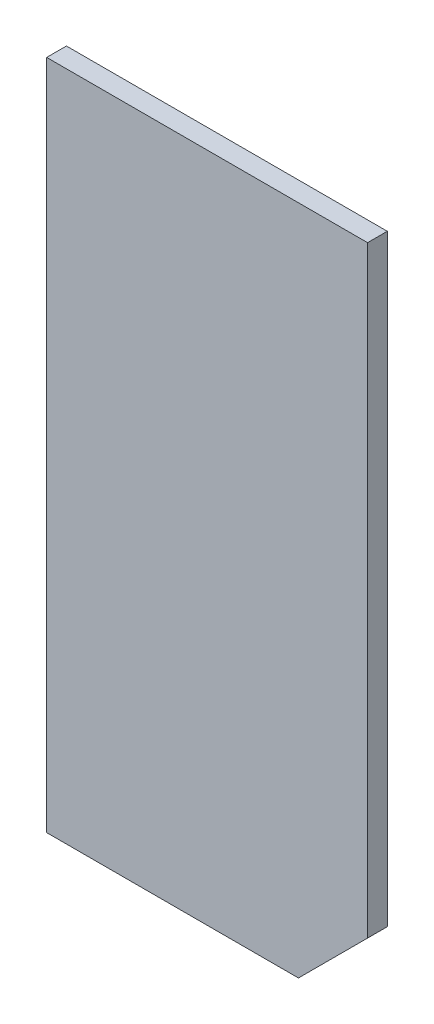
ISO-10303-21;
HEADER;
FILE_DESCRIPTION(('STEP AP214'),'2;1');
FILE_NAME('part.step','',(''),(''),'','','');
FILE_SCHEMA(('AUTOMOTIVE_DESIGN { 1 0 10303 214 1 1 1 1 }'));
ENDSEC;
DATA;
#1=APPLICATION_CONTEXT('core data for automotive mechanical design processes');
#2=APPLICATION_PROTOCOL_DEFINITION('international standard','automotive_design',2000,#1);
#3=PRODUCT_CONTEXT('',#1,'mechanical');
#4=PRODUCT('Part','Part','',(#3));
#5=PRODUCT_RELATED_PRODUCT_CATEGORY('part','',(#4));
#6=PRODUCT_DEFINITION_FORMATION('','',#4);
#7=PRODUCT_DEFINITION_CONTEXT('part definition',#1,'design');
#8=PRODUCT_DEFINITION('design','',#6,#7);
#9=PRODUCT_DEFINITION_SHAPE('','',#8);
#10=(LENGTH_UNIT() NAMED_UNIT(*) SI_UNIT(.MILLI.,.METRE.));
#11=(NAMED_UNIT(*) PLANE_ANGLE_UNIT() SI_UNIT($,.RADIAN.));
#12=(NAMED_UNIT(*) SI_UNIT($,.STERADIAN.) SOLID_ANGLE_UNIT());
#13=UNCERTAINTY_MEASURE_WITH_UNIT(LENGTH_MEASURE(1.E-05),#10,'distance_accuracy_value','');
#14=(GEOMETRIC_REPRESENTATION_CONTEXT(3) GLOBAL_UNCERTAINTY_ASSIGNED_CONTEXT((#13)) GLOBAL_UNIT_ASSIGNED_CONTEXT((#10,
#11,#12)) REPRESENTATION_CONTEXT('',''));
#15=CARTESIAN_POINT('',(0.,0.,0.));
#16=DIRECTION('',(0.,0.,1.));
#17=DIRECTION('',(1.,0.,0.));
#18=AXIS2_PLACEMENT_3D('',#15,#16,#17);
#19=CARTESIAN_POINT('',(43.990799503803,27.107119280484,0.1));
#20=DIRECTION('',(0.,0.,-1.));
#21=DIRECTION('',(0.,-1.,0.));
#22=AXIS2_PLACEMENT_3D('',#19,#20,#21);
#23=PLANE('',#22);
#24=DIRECTION('',(-1.,-8.74227765734797E-08,0.));
#25=VECTOR('',#24,1.);
#26=CARTESIAN_POINT('',(43.990799503803,27.107119280484,0.1));
#27=LINE('',#26,#25);
#28=CARTESIAN_POINT('',(43.990799503803,27.107119280484,0.1));
#29=VERTEX_POINT('',#28);
#30=CARTESIAN_POINT('',(42.365799503803,27.107119138422,0.1));
#31=VERTEX_POINT('',#30);
#32=EDGE_CURVE('E20',#29,#31,#27,.T.);
#33=ORIENTED_EDGE('',*,*,#32,.T.);
#34=DIRECTION('',(8.74227765734797E-08,-1.,0.));
#35=VECTOR('',#34,1.);
#36=CARTESIAN_POINT('',(42.365799503803,27.107119138422,0.1));
#37=LINE('',#36,#35);
#38=CARTESIAN_POINT('',(42.365799801041,23.707119138422,0.1));
#39=VERTEX_POINT('',#38);
#40=EDGE_CURVE('E92',#31,#39,#37,.T.);
#41=ORIENTED_EDGE('',*,*,#40,.T.);
#42=DIRECTION('',(1.,8.74227765734797E-08,0.));
#43=VECTOR('',#42,1.);
#44=CARTESIAN_POINT('',(42.365799801041,23.707119138422,0.1));
#45=LINE('',#44,#43);
#46=CARTESIAN_POINT('',(43.640799801041,23.707119249886,0.1));
#47=VERTEX_POINT('',#46);
#48=EDGE_CURVE('E71',#39,#47,#45,.T.);
#49=ORIENTED_EDGE('',*,*,#48,.T.);
#50=DIRECTION('',(0.707106719369045,0.707106843004045,0.));
#51=VECTOR('',#50,1.);
#52=CARTESIAN_POINT('',(43.640799801041,23.707119249886,0.1));
#53=LINE('',#52,#51);
#54=CARTESIAN_POINT('',(43.990799770443,24.057119280484,0.1));
#55=VERTEX_POINT('',#54);
#56=EDGE_CURVE('E117',#47,#55,#53,.T.);
#57=ORIENTED_EDGE('',*,*,#56,.T.);
#58=DIRECTION('',(-8.74227765734797E-08,1.,0.));
#59=VECTOR('',#58,1.);
#60=CARTESIAN_POINT('',(43.990799770443,24.057119280484,0.1));
#61=LINE('',#60,#59);
#62=EDGE_CURVE('E11',#55,#29,#61,.T.);
#63=ORIENTED_EDGE('',*,*,#62,.T.);
#64=EDGE_LOOP('',(#33,#41,#49,#57,#63));
#65=FACE_BOUND('',#64,.T.);
#66=ADVANCED_FACE('F16',(#65),#23,.F.);
#67=CARTESIAN_POINT('',(43.990799503803,27.107119280484,0.));
#68=DIRECTION('',(0.,0.,-1.));
#69=DIRECTION('',(0.,-1.,0.));
#70=AXIS2_PLACEMENT_3D('',#67,#68,#69);
#71=PLANE('',#70);
#72=DIRECTION('',(-8.74227765734797E-08,1.,0.));
#73=VECTOR('',#72,1.);
#74=CARTESIAN_POINT('',(43.990799770443,24.057119280484,0.));
#75=LINE('',#74,#73);
#76=CARTESIAN_POINT('',(43.990799770443,24.057119280484,0.));
#77=VERTEX_POINT('',#76);
#78=CARTESIAN_POINT('',(43.990799503803,27.107119280484,0.));
#79=VERTEX_POINT('',#78);
#80=EDGE_CURVE('E27',#77,#79,#75,.T.);
#81=ORIENTED_EDGE('',*,*,#80,.F.);
#82=DIRECTION('',(0.707106719369045,0.707106843004045,0.));
#83=VECTOR('',#82,1.);
#84=CARTESIAN_POINT('',(43.640799801041,23.707119249886,0.));
#85=LINE('',#84,#83);
#86=CARTESIAN_POINT('',(43.640799801041,23.707119249886,0.));
#87=VERTEX_POINT('',#86);
#88=EDGE_CURVE('E88',#87,#77,#85,.T.);
#89=ORIENTED_EDGE('',*,*,#88,.F.);
#90=DIRECTION('',(1.,8.74227765734797E-08,0.));
#91=VECTOR('',#90,1.);
#92=CARTESIAN_POINT('',(42.365799801041,23.707119138422,0.));
#93=LINE('',#92,#91);
#94=CARTESIAN_POINT('',(42.365799801041,23.707119138422,0.));
#95=VERTEX_POINT('',#94);
#96=EDGE_CURVE('E81',#95,#87,#93,.T.);
#97=ORIENTED_EDGE('',*,*,#96,.F.);
#98=DIRECTION('',(8.74227765734797E-08,-1.,0.));
#99=VECTOR('',#98,1.);
#100=CARTESIAN_POINT('',(42.365799503803,27.107119138422,0.));
#101=LINE('',#100,#99);
#102=CARTESIAN_POINT('',(42.365799503803,27.107119138422,0.));
#103=VERTEX_POINT('',#102);
#104=EDGE_CURVE('E85',#103,#95,#101,.T.);
#105=ORIENTED_EDGE('',*,*,#104,.F.);
#106=DIRECTION('',(-1.,-8.74227765734797E-08,0.));
#107=VECTOR('',#106,1.);
#108=CARTESIAN_POINT('',(43.990799503803,27.107119280484,0.));
#109=LINE('',#108,#107);
#110=EDGE_CURVE('E114',#79,#103,#109,.T.);
#111=ORIENTED_EDGE('',*,*,#110,.F.);
#112=EDGE_LOOP('',(#81,#89,#97,#105,#111));
#113=FACE_BOUND('',#112,.T.);
#114=ADVANCED_FACE('F82',(#113),#71,.T.);
#115=CARTESIAN_POINT('',(43.990799770443,24.057119280484,0.));
#116=DIRECTION('',(-1.,-8.74227765734797E-08,0.));
#117=DIRECTION('',(-8.74227765734797E-08,1.,0.));
#118=AXIS2_PLACEMENT_3D('',#115,#116,#117);
#119=PLANE('',#118);
#120=ORIENTED_EDGE('',*,*,#80,.T.);
#121=DIRECTION('',(0.,0.,1.));
#122=VECTOR('',#121,1.);
#123=CARTESIAN_POINT('',(43.990799503803,27.107119280484,0.));
#124=LINE('',#123,#122);
#125=EDGE_CURVE('E105',#79,#29,#124,.T.);
#126=ORIENTED_EDGE('',*,*,#125,.T.);
#127=ORIENTED_EDGE('',*,*,#62,.F.);
#128=DIRECTION('',(0.,0.,1.));
#129=VECTOR('',#128,1.);
#130=CARTESIAN_POINT('',(43.990799770443,24.057119280484,0.));
#131=LINE('',#130,#129);
#132=EDGE_CURVE('E120',#77,#55,#131,.T.);
#133=ORIENTED_EDGE('',*,*,#132,.F.);
#134=EDGE_LOOP('',(#120,#126,#127,#133));
#135=FACE_BOUND('',#134,.T.);
#136=ADVANCED_FACE('F136',(#135),#119,.F.);
#137=CARTESIAN_POINT('',(43.640799801041,23.707119249886,0.));
#138=DIRECTION('',(-0.707106843004045,0.707106719369045,0.));
#139=DIRECTION('',(0.,0.,1.));
#140=AXIS2_PLACEMENT_3D('',#137,#138,#139);
#141=PLANE('',#140);
#142=ORIENTED_EDGE('',*,*,#88,.T.);
#143=ORIENTED_EDGE('',*,*,#132,.T.);
#144=ORIENTED_EDGE('',*,*,#56,.F.);
#145=DIRECTION('',(0.,0.,1.));
#146=VECTOR('',#145,1.);
#147=CARTESIAN_POINT('',(43.640799801041,23.707119249886,0.));
#148=LINE('',#147,#146);
#149=EDGE_CURVE('E91',#87,#47,#148,.T.);
#150=ORIENTED_EDGE('',*,*,#149,.F.);
#151=EDGE_LOOP('',(#142,#143,#144,#150));
#152=FACE_BOUND('',#151,.T.);
#153=ADVANCED_FACE('F18',(#152),#141,.F.);
#154=CARTESIAN_POINT('',(42.365799801041,23.707119138422,0.));
#155=DIRECTION('',(-8.74227765734797E-08,1.,0.));
#156=DIRECTION('',(0.,0.,1.));
#157=AXIS2_PLACEMENT_3D('',#154,#155,#156);
#158=PLANE('',#157);
#159=ORIENTED_EDGE('',*,*,#96,.T.);
#160=ORIENTED_EDGE('',*,*,#149,.T.);
#161=ORIENTED_EDGE('',*,*,#48,.F.);
#162=DIRECTION('',(0.,0.,1.));
#163=VECTOR('',#162,1.);
#164=CARTESIAN_POINT('',(42.365799801041,23.707119138422,0.));
#165=LINE('',#164,#163);
#166=EDGE_CURVE('E95',#95,#39,#165,.T.);
#167=ORIENTED_EDGE('',*,*,#166,.F.);
#168=EDGE_LOOP('',(#159,#160,#161,#167));
#169=FACE_BOUND('',#168,.T.);
#170=ADVANCED_FACE('F96',(#169),#158,.F.);
#171=CARTESIAN_POINT('',(42.365799503803,27.107119138422,0.));
#172=DIRECTION('',(1.,8.74227765734797E-08,0.));
#173=DIRECTION('',(0.,0.,-1.));
#174=AXIS2_PLACEMENT_3D('',#171,#172,#173);
#175=PLANE('',#174);
#176=ORIENTED_EDGE('',*,*,#104,.T.);
#177=ORIENTED_EDGE('',*,*,#166,.T.);
#178=ORIENTED_EDGE('',*,*,#40,.F.);
#179=DIRECTION('',(0.,0.,1.));
#180=VECTOR('',#179,1.);
#181=CARTESIAN_POINT('',(42.365799503803,27.107119138422,0.));
#182=LINE('',#181,#180);
#183=EDGE_CURVE('E102',#103,#31,#182,.T.);
#184=ORIENTED_EDGE('',*,*,#183,.F.);
#185=EDGE_LOOP('',(#176,#177,#178,#184));
#186=FACE_BOUND('',#185,.T.);
#187=ADVANCED_FACE('F100',(#186),#175,.F.);
#188=CARTESIAN_POINT('',(43.990799503803,27.107119280484,0.));
#189=DIRECTION('',(8.74227765734797E-08,-1.,0.));
#190=DIRECTION('',(0.,0.,-1.));
#191=AXIS2_PLACEMENT_3D('',#188,#189,#190);
#192=PLANE('',#191);
#193=ORIENTED_EDGE('',*,*,#110,.T.);
#194=ORIENTED_EDGE('',*,*,#183,.T.);
#195=ORIENTED_EDGE('',*,*,#32,.F.);
#196=ORIENTED_EDGE('',*,*,#125,.F.);
#197=EDGE_LOOP('',(#193,#194,#195,#196));
#198=FACE_BOUND('',#197,.T.);
#199=ADVANCED_FACE('F132',(#198),#192,.F.);
#200=CLOSED_SHELL('',(#66,#114,#136,#153,#170,#187,#199));
#201=MANIFOLD_SOLID_BREP('B1',#200);
#202=ADVANCED_BREP_SHAPE_REPRESENTATION('',(#18,#201),#14);
#203=SHAPE_DEFINITION_REPRESENTATION(#9,#202);
ENDSEC;
END-ISO-10303-21;
